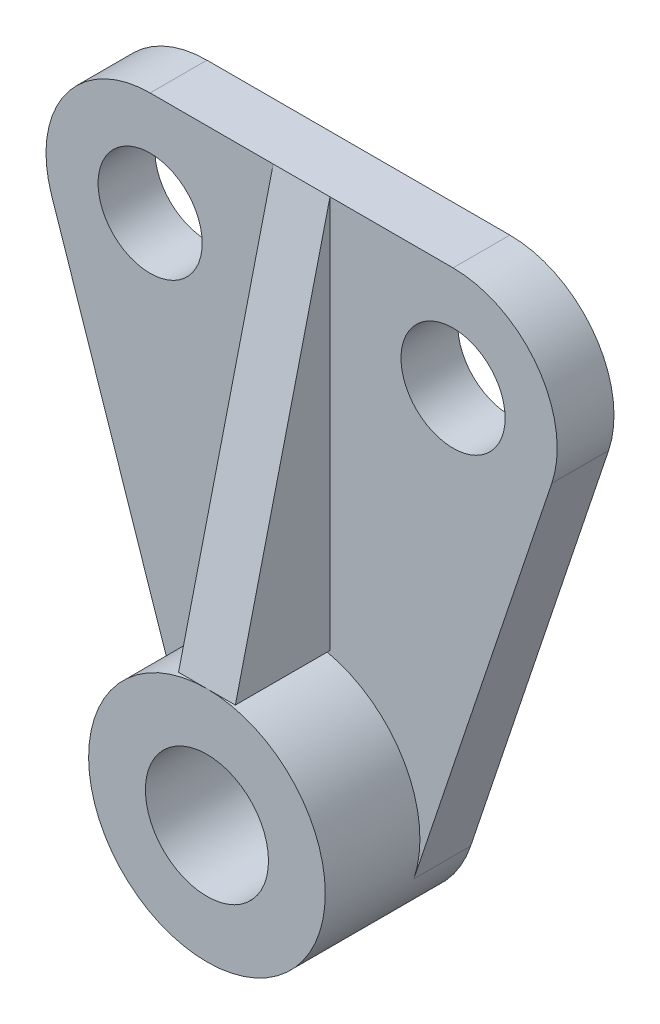
ISO-10303-21;
HEADER;
FILE_DESCRIPTION(('STEP AP214'),'2;1');
FILE_NAME('part.step','',(''),(''),'','','');
FILE_SCHEMA(('AUTOMOTIVE_DESIGN { 1 0 10303 214 1 1 1 1 }'));
ENDSEC;
DATA;
#1=APPLICATION_CONTEXT('core data for automotive mechanical design processes');
#2=APPLICATION_PROTOCOL_DEFINITION('international standard','automotive_design',2000,#1);
#3=PRODUCT_CONTEXT('',#1,'mechanical');
#4=PRODUCT('Part','Part','',(#3));
#5=PRODUCT_RELATED_PRODUCT_CATEGORY('part','',(#4));
#6=PRODUCT_DEFINITION_FORMATION('','',#4);
#7=PRODUCT_DEFINITION_CONTEXT('part definition',#1,'design');
#8=PRODUCT_DEFINITION('design','',#6,#7);
#9=PRODUCT_DEFINITION_SHAPE('','',#8);
#10=(LENGTH_UNIT() NAMED_UNIT(*) SI_UNIT(.MILLI.,.METRE.));
#11=(NAMED_UNIT(*) PLANE_ANGLE_UNIT() SI_UNIT($,.RADIAN.));
#12=(NAMED_UNIT(*) SI_UNIT($,.STERADIAN.) SOLID_ANGLE_UNIT());
#13=UNCERTAINTY_MEASURE_WITH_UNIT(LENGTH_MEASURE(1.E-05),#10,'distance_accuracy_value','');
#14=(GEOMETRIC_REPRESENTATION_CONTEXT(3) GLOBAL_UNCERTAINTY_ASSIGNED_CONTEXT((#13)) GLOBAL_UNIT_ASSIGNED_CONTEXT((#10,
#11,#12)) REPRESENTATION_CONTEXT('',''));
#15=CARTESIAN_POINT('',(0.,0.,0.));
#16=DIRECTION('',(0.,0.,1.));
#17=DIRECTION('',(1.,0.,0.));
#18=AXIS2_PLACEMENT_3D('',#15,#16,#17);
#19=CARTESIAN_POINT('',(-48.025903813055,-22.6978095085225,11.));
#20=DIRECTION('',(0.,-1.,0.));
#21=DIRECTION('',(1.,0.,0.));
#22=AXIS2_PLACEMENT_3D('',#19,#20,#21);
#23=PLANE('',#22);
#24=DIRECTION('',(0.,0.,1.));
#25=VECTOR('',#24,1.);
#26=CARTESIAN_POINT('',(-36.025903813055,-22.6978095085225,11.));
#27=LINE('',#26,#25);
#28=CARTESIAN_POINT('',(-36.025903813055,-22.6978095085225,11.));
#29=VERTEX_POINT('',#28);
#30=CARTESIAN_POINT('',(-36.025903813055,-22.6978095085225,32.));
#31=VERTEX_POINT('',#30);
#32=EDGE_CURVE('E56',#29,#31,#27,.T.);
#33=ORIENTED_EDGE('',*,*,#32,.T.);
#34=DIRECTION('',(1.,0.,0.));
#35=VECTOR('',#34,1.);
#36=CARTESIAN_POINT('',(-48.025903813055,-22.6978095085225,32.));
#37=LINE('',#36,#35);
#38=CARTESIAN_POINT('',(-48.025903813055,-22.6978095085225,32.));
#39=VERTEX_POINT('',#38);
#40=EDGE_CURVE('E103',#39,#31,#37,.T.);
#41=ORIENTED_EDGE('',*,*,#40,.F.);
#42=DIRECTION('',(0.,0.,1.));
#43=VECTOR('',#42,1.);
#44=CARTESIAN_POINT('',(-48.025903813055,-22.6978095085225,11.));
#45=LINE('',#44,#43);
#46=CARTESIAN_POINT('',(-48.025903813055,-22.6978095085225,11.));
#47=VERTEX_POINT('',#46);
#48=EDGE_CURVE('E12',#47,#39,#45,.T.);
#49=ORIENTED_EDGE('',*,*,#48,.F.);
#50=DIRECTION('',(1.,0.,0.));
#51=VECTOR('',#50,1.);
#52=CARTESIAN_POINT('',(-48.025903813055,-22.6978095085225,11.));
#53=LINE('',#52,#51);
#54=EDGE_CURVE('E118',#47,#29,#53,.T.);
#55=ORIENTED_EDGE('',*,*,#54,.T.);
#56=EDGE_LOOP('',(#33,#41,#49,#55));
#57=FACE_BOUND('',#56,.T.);
#58=ADVANCED_FACE('F53',(#57),#23,.T.);
#59=CARTESIAN_POINT('',(-48.025903813055,60.3021904914775,11.));
#60=DIRECTION('',(-1.,0.,0.));
#61=DIRECTION('',(0.,-1.,0.));
#62=AXIS2_PLACEMENT_3D('',#59,#60,#61);
#63=PLANE('',#62);
#64=DIRECTION('',(0.,-0.972174257920041,0.23425885733013));
#65=VECTOR('',#64,1.);
#66=CARTESIAN_POINT('',(-48.025903813055,60.3021904914775,12.));
#67=LINE('',#66,#65);
#68=CARTESIAN_POINT('',(-48.025903813055,60.3021904914775,12.));
#69=VERTEX_POINT('',#68);
#70=EDGE_CURVE('E97',#69,#39,#67,.T.);
#71=ORIENTED_EDGE('',*,*,#70,.F.);
#72=DIRECTION('',(0.,0.,1.));
#73=VECTOR('',#72,1.);
#74=CARTESIAN_POINT('',(-48.025903813055,60.3021904914775,11.));
#75=LINE('',#74,#73);
#76=CARTESIAN_POINT('',(-48.025903813055,60.3021904914775,11.));
#77=VERTEX_POINT('',#76);
#78=EDGE_CURVE('E61',#77,#69,#75,.T.);
#79=ORIENTED_EDGE('',*,*,#78,.F.);
#80=DIRECTION('',(0.,-1.,0.));
#81=VECTOR('',#80,1.);
#82=CARTESIAN_POINT('',(-48.025903813055,60.3021904914775,11.));
#83=LINE('',#82,#81);
#84=EDGE_CURVE('E113',#77,#47,#83,.T.);
#85=ORIENTED_EDGE('',*,*,#84,.T.);
#86=ORIENTED_EDGE('',*,*,#48,.T.);
#87=EDGE_LOOP('',(#71,#79,#85,#86));
#88=FACE_BOUND('',#87,.T.);
#89=ADVANCED_FACE('F105',(#88),#63,.T.);
#90=CARTESIAN_POINT('',(-48.025903813055,60.3021904914775,11.));
#91=DIRECTION('',(0.,-1.,0.));
#92=DIRECTION('',(0.,0.,-1.));
#93=AXIS2_PLACEMENT_3D('',#90,#91,#92);
#94=PLANE('',#93);
#95=ORIENTED_EDGE('',*,*,#78,.T.);
#96=DIRECTION('',(-1.,0.,0.));
#97=VECTOR('',#96,1.);
#98=CARTESIAN_POINT('',(11.975096186945,60.3021904914775,12.));
#99=LINE('',#98,#97);
#100=CARTESIAN_POINT('',(-36.025903813055,60.3021904914775,12.));
#101=VERTEX_POINT('',#100);
#102=EDGE_CURVE('E95',#101,#69,#99,.T.);
#103=ORIENTED_EDGE('',*,*,#102,.F.);
#104=DIRECTION('',(0.,0.,1.));
#105=VECTOR('',#104,1.);
#106=CARTESIAN_POINT('',(-36.025903813055,60.3021904914775,11.));
#107=LINE('',#106,#105);
#108=CARTESIAN_POINT('',(-36.025903813055,60.3021904914775,11.));
#109=VERTEX_POINT('',#108);
#110=EDGE_CURVE('E110',#109,#101,#107,.T.);
#111=ORIENTED_EDGE('',*,*,#110,.F.);
#112=DIRECTION('',(1.,0.,0.));
#113=VECTOR('',#112,1.);
#114=CARTESIAN_POINT('',(-48.025903813055,60.3021904914775,11.));
#115=LINE('',#114,#113);
#116=EDGE_CURVE('E108',#77,#109,#115,.T.);
#117=ORIENTED_EDGE('',*,*,#116,.F.);
#118=EDGE_LOOP('',(#95,#103,#111,#117));
#119=FACE_BOUND('',#118,.T.);
#120=ADVANCED_FACE('F107',(#119),#94,.F.);
#121=CARTESIAN_POINT('',(-36.025903813055,60.3021904914775,11.));
#122=DIRECTION('',(-1.,0.,0.));
#123=DIRECTION('',(0.,-1.,0.));
#124=AXIS2_PLACEMENT_3D('',#121,#122,#123);
#125=PLANE('',#124);
#126=ORIENTED_EDGE('',*,*,#110,.T.);
#127=DIRECTION('',(0.,0.972174257920041,-0.23425885733013));
#128=VECTOR('',#127,1.);
#129=CARTESIAN_POINT('',(-36.025903813055,60.3021904914775,12.));
#130=LINE('',#129,#128);
#131=EDGE_CURVE('E99',#31,#101,#130,.T.);
#132=ORIENTED_EDGE('',*,*,#131,.F.);
#133=ORIENTED_EDGE('',*,*,#32,.F.);
#134=DIRECTION('',(0.,-1.,0.));
#135=VECTOR('',#134,1.);
#136=CARTESIAN_POINT('',(-36.025903813055,60.3021904914775,11.));
#137=LINE('',#136,#135);
#138=EDGE_CURVE('E116',#109,#29,#137,.T.);
#139=ORIENTED_EDGE('',*,*,#138,.F.);
#140=EDGE_LOOP('',(#126,#132,#133,#139));
#141=FACE_BOUND('',#140,.T.);
#142=ADVANCED_FACE('F124',(#141),#125,.F.);
#143=CARTESIAN_POINT('',(0.,0.,11.));
#144=DIRECTION('',(0.,0.,-1.));
#145=DIRECTION('',(-1.,0.,0.));
#146=AXIS2_PLACEMENT_3D('',#143,#144,#145);
#147=PLANE('',#146);
#148=ORIENTED_EDGE('',*,*,#54,.F.);
#149=ORIENTED_EDGE('',*,*,#84,.F.);
#150=ORIENTED_EDGE('',*,*,#116,.T.);
#151=ORIENTED_EDGE('',*,*,#138,.T.);
#152=EDGE_LOOP('',(#148,#149,#150,#151));
#153=FACE_BOUND('',#152,.T.);
#154=ADVANCED_FACE('F127',(#153),#147,.T.);
#155=CARTESIAN_POINT('',(11.975096186945,60.3021904914775,12.));
#156=DIRECTION('',(0.,-0.23425885733013,-0.972174257920041));
#157=DIRECTION('',(0.,0.972174257920041,-0.23425885733013));
#158=AXIS2_PLACEMENT_3D('',#155,#156,#157);
#159=PLANE('',#158);
#160=ORIENTED_EDGE('',*,*,#131,.T.);
#161=ORIENTED_EDGE('',*,*,#102,.T.);
#162=ORIENTED_EDGE('',*,*,#70,.T.);
#163=ORIENTED_EDGE('',*,*,#40,.T.);
#164=EDGE_LOOP('',(#160,#161,#162,#163));
#165=FACE_BOUND('',#164,.T.);
#166=ADVANCED_FACE('F96',(#165),#159,.F.);
#167=CLOSED_SHELL('',(#58,#89,#120,#142,#154,#166));
#168=MANIFOLD_SOLID_BREP('B2',#167);
#169=CARTESIAN_POINT('',(-74.025903813055,38.3021904914775,12.));
#170=DIRECTION('',(0.,0.,1.));
#171=DIRECTION('',(1.,0.,0.));
#172=AXIS2_PLACEMENT_3D('',#169,#170,#171);
#173=PLANE('',#172);
#174=CARTESIAN_POINT('',(-42.025903813055,-47.6978095085225,12.));
#175=DIRECTION('',(0.,0.,1.));
#176=DIRECTION('',(1.,0.,0.));
#177=AXIS2_PLACEMENT_3D('',#174,#175,#176);
#178=CIRCLE('',#177,25.);
#179=CARTESIAN_POINT('',(-18.3228475186118,-55.6454583622688,12.));
#180=VERTEX_POINT('',#179);
#181=CARTESIAN_POINT('',(-65.7289601074982,-55.6454583622688,12.));
#182=VERTEX_POINT('',#181);
#183=EDGE_CURVE('E51',#180,#182,#178,.T.);
#184=ORIENTED_EDGE('',*,*,#183,.F.);
#185=DIRECTION('',(0.317905954149853,0.948122251777729,0.));
#186=VECTOR('',#185,1.);
#187=CARTESIAN_POINT('',(10.832785726055,31.3082595001808,12.));
#188=LINE('',#187,#186);
#189=CARTESIAN_POINT('',(10.832785726055,31.3082595001808,12.));
#190=VERTEX_POINT('',#189);
#191=EDGE_CURVE('E241',#180,#190,#188,.T.);
#192=ORIENTED_EDGE('',*,*,#191,.T.);
#193=CARTESIAN_POINT('',(-10.025903813055,38.3021904914775,12.));
#194=DIRECTION('',(0.,0.,1.));
#195=DIRECTION('',(1.,0.,0.));
#196=AXIS2_PLACEMENT_3D('',#193,#194,#195);
#197=CIRCLE('',#196,22.);
#198=CARTESIAN_POINT('',(-10.025903813055,60.3021904914775,12.));
#199=VERTEX_POINT('',#198);
#200=EDGE_CURVE('E245',#190,#199,#197,.T.);
#201=ORIENTED_EDGE('',*,*,#200,.T.);
#202=DIRECTION('',(-1.,0.,0.));
#203=VECTOR('',#202,1.);
#204=CARTESIAN_POINT('',(-74.025903813055,60.3021904914775,12.));
#205=LINE('',#204,#203);
#206=CARTESIAN_POINT('',(-74.025903813055,60.3021904914775,12.));
#207=VERTEX_POINT('',#206);
#208=EDGE_CURVE('E199',#199,#207,#205,.T.);
#209=ORIENTED_EDGE('',*,*,#208,.T.);
#210=CARTESIAN_POINT('',(-74.025903813055,38.3021904914775,12.));
#211=DIRECTION('',(0.,0.,1.));
#212=DIRECTION('',(1.,0.,0.));
#213=AXIS2_PLACEMENT_3D('',#210,#211,#212);
#214=CIRCLE('',#213,22.);
#215=CARTESIAN_POINT('',(-94.884593352165,31.3082595001808,12.));
#216=VERTEX_POINT('',#215);
#217=EDGE_CURVE('E279',#207,#216,#214,.T.);
#218=ORIENTED_EDGE('',*,*,#217,.T.);
#219=DIRECTION('',(0.317905954149853,-0.948122251777729,0.));
#220=VECTOR('',#219,1.);
#221=CARTESIAN_POINT('',(-94.884593352165,31.3082595001808,12.));
#222=LINE('',#221,#220);
#223=EDGE_CURVE('E235',#216,#182,#222,.T.);
#224=ORIENTED_EDGE('',*,*,#223,.T.);
#225=EDGE_LOOP('',(#184,#192,#201,#209,#218,#224));
#226=FACE_BOUND('',#225,.T.);
#227=CARTESIAN_POINT('',(-10.025903813055,38.3021904914775,12.));
#228=DIRECTION('',(0.,0.,1.));
#229=DIRECTION('',(1.,0.,0.));
#230=AXIS2_PLACEMENT_3D('',#227,#228,#229);
#231=CIRCLE('',#230,11.);
#232=CARTESIAN_POINT('',(0.974096186944998,38.3021904914775,12.));
#233=VERTEX_POINT('',#232);
#234=EDGE_CURVE('E301',#233,#233,#231,.T.);
#235=ORIENTED_EDGE('',*,*,#234,.F.);
#236=EDGE_LOOP('',(#235));
#237=FACE_BOUND('',#236,.T.);
#238=CARTESIAN_POINT('',(-74.025903813055,38.3021904914775,12.));
#239=DIRECTION('',(0.,0.,1.));
#240=DIRECTION('',(1.,0.,0.));
#241=AXIS2_PLACEMENT_3D('',#238,#239,#240);
#242=CIRCLE('',#241,11.);
#243=CARTESIAN_POINT('',(-63.025903813055,38.3021904914775,12.));
#244=VERTEX_POINT('',#243);
#245=EDGE_CURVE('E271',#244,#244,#242,.T.);
#246=ORIENTED_EDGE('',*,*,#245,.F.);
#247=EDGE_LOOP('',(#246));
#248=FACE_BOUND('',#247,.T.);
#249=ADVANCED_FACE('F177',(#226,#237,#248),#173,.T.);
#250=CARTESIAN_POINT('',(-74.025903813055,38.3021904914775,0.));
#251=DIRECTION('',(0.,0.,1.));
#252=DIRECTION('',(1.,0.,0.));
#253=AXIS2_PLACEMENT_3D('',#250,#251,#252);
#254=PLANE('',#253);
#255=CARTESIAN_POINT('',(-74.025903813055,38.3021904914775,0.));
#256=DIRECTION('',(0.,0.,1.));
#257=DIRECTION('',(1.,0.,0.));
#258=AXIS2_PLACEMENT_3D('',#255,#256,#257);
#259=CIRCLE('',#258,22.);
#260=CARTESIAN_POINT('',(-74.025903813055,60.3021904914775,0.));
#261=VERTEX_POINT('',#260);
#262=CARTESIAN_POINT('',(-94.884593352165,31.3082595001808,0.));
#263=VERTEX_POINT('',#262);
#264=EDGE_CURVE('E267',#261,#263,#259,.T.);
#265=ORIENTED_EDGE('',*,*,#264,.F.);
#266=DIRECTION('',(-1.,0.,0.));
#267=VECTOR('',#266,1.);
#268=CARTESIAN_POINT('',(-74.025903813055,60.3021904914775,0.));
#269=LINE('',#268,#267);
#270=CARTESIAN_POINT('',(-10.025903813055,60.3021904914775,0.));
#271=VERTEX_POINT('',#270);
#272=EDGE_CURVE('E226',#271,#261,#269,.T.);
#273=ORIENTED_EDGE('',*,*,#272,.F.);
#274=CARTESIAN_POINT('',(-10.025903813055,38.3021904914775,0.));
#275=DIRECTION('',(0.,0.,1.));
#276=DIRECTION('',(1.,0.,0.));
#277=AXIS2_PLACEMENT_3D('',#274,#275,#276);
#278=CIRCLE('',#277,22.);
#279=CARTESIAN_POINT('',(10.832785726055,31.3082595001808,0.));
#280=VERTEX_POINT('',#279);
#281=EDGE_CURVE('E276',#280,#271,#278,.T.);
#282=ORIENTED_EDGE('',*,*,#281,.F.);
#283=DIRECTION('',(0.317905954149853,0.948122251777729,0.));
#284=VECTOR('',#283,1.);
#285=CARTESIAN_POINT('',(10.832785726055,31.3082595001808,0.));
#286=LINE('',#285,#284);
#287=CARTESIAN_POINT('',(-18.3228475186118,-55.6454583622688,0.));
#288=VERTEX_POINT('',#287);
#289=EDGE_CURVE('E255',#288,#280,#286,.T.);
#290=ORIENTED_EDGE('',*,*,#289,.F.);
#291=CARTESIAN_POINT('',(-42.025903813055,-47.6978095085225,0.));
#292=DIRECTION('',(0.,0.,1.));
#293=DIRECTION('',(1.,0.,0.));
#294=AXIS2_PLACEMENT_3D('',#291,#292,#293);
#295=CIRCLE('',#294,25.);
#296=CARTESIAN_POINT('',(-65.7289601074982,-55.6454583622688,0.));
#297=VERTEX_POINT('',#296);
#298=EDGE_CURVE('E273',#297,#288,#295,.T.);
#299=ORIENTED_EDGE('',*,*,#298,.F.);
#300=DIRECTION('',(0.317905954149853,-0.948122251777729,0.));
#301=VECTOR('',#300,1.);
#302=CARTESIAN_POINT('',(-94.884593352165,31.3082595001808,0.));
#303=LINE('',#302,#301);
#304=EDGE_CURVE('E270',#263,#297,#303,.T.);
#305=ORIENTED_EDGE('',*,*,#304,.F.);
#306=EDGE_LOOP('',(#265,#273,#282,#290,#299,#305));
#307=FACE_BOUND('',#306,.T.);
#308=CARTESIAN_POINT('',(-74.025903813055,38.3021904914775,0.));
#309=DIRECTION('',(0.,0.,1.));
#310=DIRECTION('',(1.,0.,0.));
#311=AXIS2_PLACEMENT_3D('',#308,#309,#310);
#312=CIRCLE('',#311,11.);
#313=CARTESIAN_POINT('',(-63.025903813055,38.3021904914775,0.));
#314=VERTEX_POINT('',#313);
#315=EDGE_CURVE('E298',#314,#314,#312,.T.);
#316=ORIENTED_EDGE('',*,*,#315,.T.);
#317=EDGE_LOOP('',(#316));
#318=FACE_BOUND('',#317,.T.);
#319=CARTESIAN_POINT('',(-10.025903813055,38.3021904914775,0.));
#320=DIRECTION('',(0.,0.,1.));
#321=DIRECTION('',(1.,0.,0.));
#322=AXIS2_PLACEMENT_3D('',#319,#320,#321);
#323=CIRCLE('',#322,11.);
#324=CARTESIAN_POINT('',(0.974096186944998,38.3021904914775,0.));
#325=VERTEX_POINT('',#324);
#326=EDGE_CURVE('E304',#325,#325,#323,.T.);
#327=ORIENTED_EDGE('',*,*,#326,.T.);
#328=EDGE_LOOP('',(#327));
#329=FACE_BOUND('',#328,.T.);
#330=CARTESIAN_POINT('',(-42.025903813055,-47.6978095085225,0.));
#331=DIRECTION('',(0.,0.,1.));
#332=DIRECTION('',(1.,0.,0.));
#333=AXIS2_PLACEMENT_3D('',#330,#331,#332);
#334=CIRCLE('',#333,13.);
#335=CARTESIAN_POINT('',(-29.025903813055,-47.6978095085225,0.));
#336=VERTEX_POINT('',#335);
#337=EDGE_CURVE('E307',#336,#336,#334,.T.);
#338=ORIENTED_EDGE('',*,*,#337,.T.);
#339=EDGE_LOOP('',(#338));
#340=FACE_BOUND('',#339,.T.);
#341=ADVANCED_FACE('F292',(#307,#318,#329,#340),#254,.F.);
#342=CARTESIAN_POINT('',(-74.025903813055,38.3021904914775,12.));
#343=DIRECTION('',(0.,0.,-1.));
#344=DIRECTION('',(-1.,0.,0.));
#345=AXIS2_PLACEMENT_3D('',#342,#343,#344);
#346=CYLINDRICAL_SURFACE('',#345,22.);
#347=ORIENTED_EDGE('',*,*,#264,.T.);
#348=DIRECTION('',(0.,0.,-1.));
#349=VECTOR('',#348,1.);
#350=CARTESIAN_POINT('',(-94.884593352165,31.3082595001808,12.));
#351=LINE('',#350,#349);
#352=EDGE_CURVE('E181',#216,#263,#351,.T.);
#353=ORIENTED_EDGE('',*,*,#352,.F.);
#354=ORIENTED_EDGE('',*,*,#217,.F.);
#355=DIRECTION('',(0.,0.,-1.));
#356=VECTOR('',#355,1.);
#357=CARTESIAN_POINT('',(-74.025903813055,60.3021904914775,12.));
#358=LINE('',#357,#356);
#359=EDGE_CURVE('E263',#207,#261,#358,.T.);
#360=ORIENTED_EDGE('',*,*,#359,.T.);
#361=EDGE_LOOP('',(#347,#353,#354,#360));
#362=FACE_BOUND('',#361,.T.);
#363=ADVANCED_FACE('F179',(#362),#346,.T.);
#364=CARTESIAN_POINT('',(-94.884593352165,31.3082595001808,12.));
#365=DIRECTION('',(0.948122251777729,0.317905954149853,0.));
#366=DIRECTION('',(-0.317905954149853,0.948122251777729,0.));
#367=AXIS2_PLACEMENT_3D('',#364,#365,#366);
#368=PLANE('',#367);
#369=ORIENTED_EDGE('',*,*,#304,.T.);
#370=DIRECTION('',(0.,0.,-1.));
#371=VECTOR('',#370,1.);
#372=CARTESIAN_POINT('',(-65.7289601074982,-55.6454583622688,12.));
#373=LINE('',#372,#371);
#374=EDGE_CURVE('E282',#182,#297,#373,.T.);
#375=ORIENTED_EDGE('',*,*,#374,.F.);
#376=ORIENTED_EDGE('',*,*,#223,.F.);
#377=ORIENTED_EDGE('',*,*,#352,.T.);
#378=EDGE_LOOP('',(#369,#375,#376,#377));
#379=FACE_BOUND('',#378,.T.);
#380=ADVANCED_FACE('F287',(#379),#368,.F.);
#381=CARTESIAN_POINT('',(-42.025903813055,-47.6978095085225,12.));
#382=DIRECTION('',(0.,0.,-1.));
#383=DIRECTION('',(-1.,0.,0.));
#384=AXIS2_PLACEMENT_3D('',#381,#382,#383);
#385=CYLINDRICAL_SURFACE('',#384,25.);
#386=ORIENTED_EDGE('',*,*,#298,.T.);
#387=DIRECTION('',(0.,0.,-1.));
#388=VECTOR('',#387,1.);
#389=CARTESIAN_POINT('',(-18.3228475186118,-55.6454583622688,12.));
#390=LINE('',#389,#388);
#391=EDGE_CURVE('E258',#180,#288,#390,.T.);
#392=ORIENTED_EDGE('',*,*,#391,.F.);
#393=ORIENTED_EDGE('',*,*,#183,.T.);
#394=ORIENTED_EDGE('',*,*,#374,.T.);
#395=EDGE_LOOP('',(#386,#392,#393,#394));
#396=FACE_BOUND('',#395,.T.);
#397=CARTESIAN_POINT('',(-42.025903813055,-47.6978095085225,32.));
#398=DIRECTION('',(0.,0.,1.));
#399=DIRECTION('',(1.,0.,0.));
#400=AXIS2_PLACEMENT_3D('',#397,#398,#399);
#401=CIRCLE('',#400,25.);
#402=CARTESIAN_POINT('',(-42.025903813055,-22.6978095085225,32.));
#403=VERTEX_POINT('',#402);
#404=EDGE_CURVE('E191',#403,#403,#401,.T.);
#405=ORIENTED_EDGE('',*,*,#404,.F.);
#406=EDGE_LOOP('',(#405));
#407=FACE_BOUND('',#406,.T.);
#408=ADVANCED_FACE('F294',(#396,#407),#385,.T.);
#409=CARTESIAN_POINT('',(10.832785726055,31.3082595001808,12.));
#410=DIRECTION('',(-0.948122251777729,0.317905954149853,0.));
#411=DIRECTION('',(-0.317905954149853,-0.948122251777729,0.));
#412=AXIS2_PLACEMENT_3D('',#409,#410,#411);
#413=PLANE('',#412);
#414=ORIENTED_EDGE('',*,*,#289,.T.);
#415=DIRECTION('',(0.,0.,-1.));
#416=VECTOR('',#415,1.);
#417=CARTESIAN_POINT('',(10.832785726055,31.3082595001808,12.));
#418=LINE('',#417,#416);
#419=EDGE_CURVE('E252',#190,#280,#418,.T.);
#420=ORIENTED_EDGE('',*,*,#419,.F.);
#421=ORIENTED_EDGE('',*,*,#191,.F.);
#422=ORIENTED_EDGE('',*,*,#391,.T.);
#423=EDGE_LOOP('',(#414,#420,#421,#422));
#424=FACE_BOUND('',#423,.T.);
#425=ADVANCED_FACE('F253',(#424),#413,.F.);
#426=CARTESIAN_POINT('',(-10.025903813055,38.3021904914775,12.));
#427=DIRECTION('',(0.,0.,-1.));
#428=DIRECTION('',(-1.,0.,0.));
#429=AXIS2_PLACEMENT_3D('',#426,#427,#428);
#430=CYLINDRICAL_SURFACE('',#429,22.);
#431=ORIENTED_EDGE('',*,*,#281,.T.);
#432=DIRECTION('',(0.,0.,-1.));
#433=VECTOR('',#432,1.);
#434=CARTESIAN_POINT('',(-10.025903813055,60.3021904914775,12.));
#435=LINE('',#434,#433);
#436=EDGE_CURVE('E259',#199,#271,#435,.T.);
#437=ORIENTED_EDGE('',*,*,#436,.F.);
#438=ORIENTED_EDGE('',*,*,#200,.F.);
#439=ORIENTED_EDGE('',*,*,#419,.T.);
#440=EDGE_LOOP('',(#431,#437,#438,#439));
#441=FACE_BOUND('',#440,.T.);
#442=ADVANCED_FACE('F261',(#441),#430,.T.);
#443=CARTESIAN_POINT('',(-74.025903813055,60.3021904914775,12.));
#444=DIRECTION('',(0.,-1.,0.));
#445=DIRECTION('',(1.,0.,0.));
#446=AXIS2_PLACEMENT_3D('',#443,#444,#445);
#447=PLANE('',#446);
#448=ORIENTED_EDGE('',*,*,#272,.T.);
#449=ORIENTED_EDGE('',*,*,#359,.F.);
#450=ORIENTED_EDGE('',*,*,#208,.F.);
#451=ORIENTED_EDGE('',*,*,#436,.T.);
#452=EDGE_LOOP('',(#448,#449,#450,#451));
#453=FACE_BOUND('',#452,.T.);
#454=ADVANCED_FACE('F343',(#453),#447,.F.);
#455=CARTESIAN_POINT('',(-74.025903813055,38.3021904914775,12.));
#456=DIRECTION('',(0.,0.,-1.));
#457=DIRECTION('',(-1.,0.,0.));
#458=AXIS2_PLACEMENT_3D('',#455,#456,#457);
#459=CYLINDRICAL_SURFACE('',#458,11.);
#460=ORIENTED_EDGE('',*,*,#245,.T.);
#461=EDGE_LOOP('',(#460));
#462=FACE_BOUND('',#461,.T.);
#463=ORIENTED_EDGE('',*,*,#315,.F.);
#464=EDGE_LOOP('',(#463));
#465=FACE_BOUND('',#464,.T.);
#466=ADVANCED_FACE('F340',(#462,#465),#459,.F.);
#467=CARTESIAN_POINT('',(-10.025903813055,38.3021904914775,12.));
#468=DIRECTION('',(0.,0.,-1.));
#469=DIRECTION('',(-1.,0.,0.));
#470=AXIS2_PLACEMENT_3D('',#467,#468,#469);
#471=CYLINDRICAL_SURFACE('',#470,11.);
#472=ORIENTED_EDGE('',*,*,#234,.T.);
#473=EDGE_LOOP('',(#472));
#474=FACE_BOUND('',#473,.T.);
#475=ORIENTED_EDGE('',*,*,#326,.F.);
#476=EDGE_LOOP('',(#475));
#477=FACE_BOUND('',#476,.T.);
#478=ADVANCED_FACE('F328',(#474,#477),#471,.F.);
#479=CARTESIAN_POINT('',(-42.025903813055,-47.6978095085225,12.));
#480=DIRECTION('',(0.,0.,-1.));
#481=DIRECTION('',(-1.,0.,0.));
#482=AXIS2_PLACEMENT_3D('',#479,#480,#481);
#483=CYLINDRICAL_SURFACE('',#482,13.);
#484=ORIENTED_EDGE('',*,*,#337,.F.);
#485=EDGE_LOOP('',(#484));
#486=FACE_BOUND('',#485,.T.);
#487=CARTESIAN_POINT('',(-42.025903813055,-47.6978095085225,32.));
#488=DIRECTION('',(0.,0.,1.));
#489=DIRECTION('',(1.,0.,0.));
#490=AXIS2_PLACEMENT_3D('',#487,#488,#489);
#491=CIRCLE('',#490,13.);
#492=CARTESIAN_POINT('',(-29.025903813055,-47.6978095085225,32.));
#493=VERTEX_POINT('',#492);
#494=EDGE_CURVE('E313',#493,#493,#491,.T.);
#495=ORIENTED_EDGE('',*,*,#494,.T.);
#496=EDGE_LOOP('',(#495));
#497=FACE_BOUND('',#496,.T.);
#498=ADVANCED_FACE('F317',(#486,#497),#483,.F.);
#499=CARTESIAN_POINT('',(-42.025903813055,-47.6978095085225,32.));
#500=DIRECTION('',(0.,0.,1.));
#501=DIRECTION('',(1.,0.,0.));
#502=AXIS2_PLACEMENT_3D('',#499,#500,#501);
#503=PLANE('',#502);
#504=ORIENTED_EDGE('',*,*,#494,.F.);
#505=EDGE_LOOP('',(#504));
#506=FACE_BOUND('',#505,.T.);
#507=ORIENTED_EDGE('',*,*,#404,.T.);
#508=EDGE_LOOP('',(#507));
#509=FACE_BOUND('',#508,.T.);
#510=ADVANCED_FACE('F319',(#506,#509),#503,.T.);
#511=CLOSED_SHELL('',(#249,#341,#363,#380,#408,#425,#442,#454,#466,#478,#498,#510));
#512=MANIFOLD_SOLID_BREP('B6',#511);
#513=ADVANCED_BREP_SHAPE_REPRESENTATION('',(#18,#168,#512),#14);
#514=SHAPE_DEFINITION_REPRESENTATION(#9,#513);
ENDSEC;
END-ISO-10303-21;
